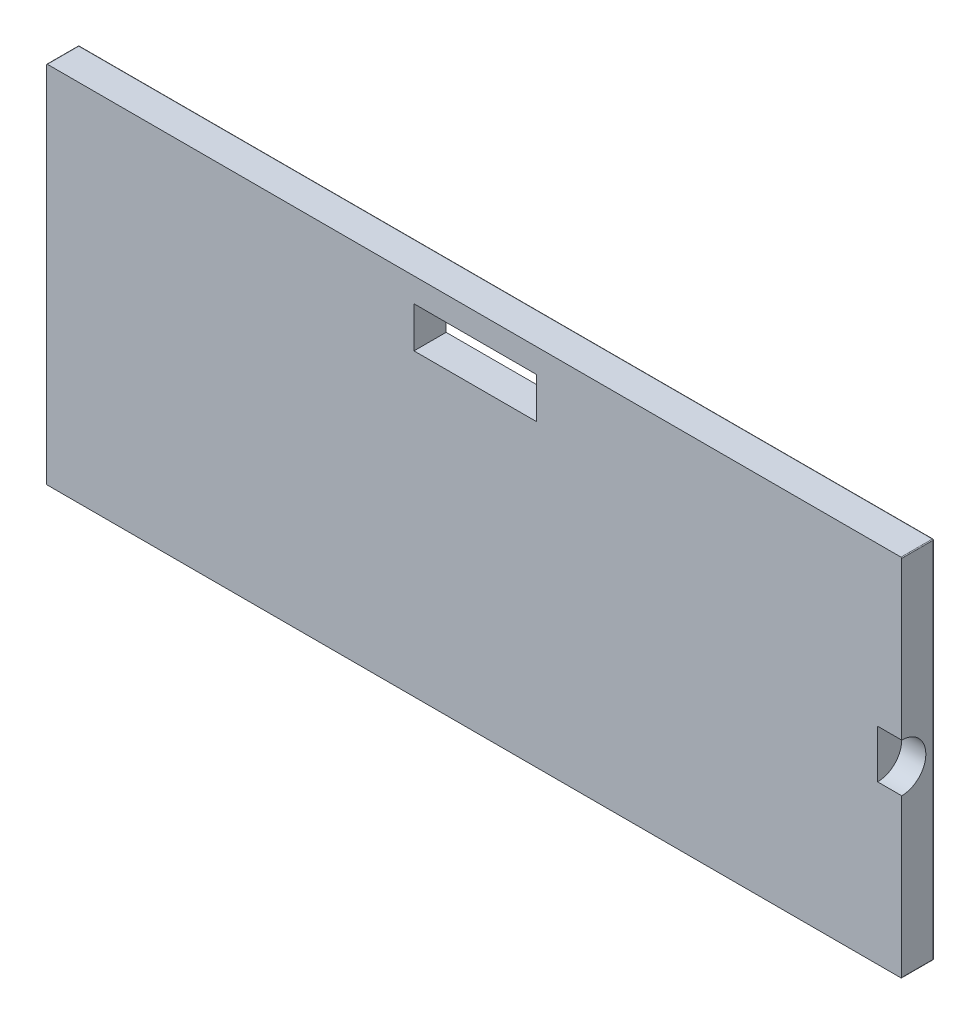
ISO-10303-21;
HEADER;
FILE_DESCRIPTION(('STEP AP214'),'2;1');
FILE_NAME('part.step','',(''),(''),'','','');
FILE_SCHEMA(('AUTOMOTIVE_DESIGN { 1 0 10303 214 1 1 1 1 }'));
ENDSEC;
DATA;
#1=APPLICATION_CONTEXT('core data for automotive mechanical design processes');
#2=APPLICATION_PROTOCOL_DEFINITION('international standard','automotive_design',2000,#1);
#3=PRODUCT_CONTEXT('',#1,'mechanical');
#4=PRODUCT('Part','Part','',(#3));
#5=PRODUCT_RELATED_PRODUCT_CATEGORY('part','',(#4));
#6=PRODUCT_DEFINITION_FORMATION('','',#4);
#7=PRODUCT_DEFINITION_CONTEXT('part definition',#1,'design');
#8=PRODUCT_DEFINITION('design','',#6,#7);
#9=PRODUCT_DEFINITION_SHAPE('','',#8);
#10=(LENGTH_UNIT() NAMED_UNIT(*) SI_UNIT(.MILLI.,.METRE.));
#11=(NAMED_UNIT(*) PLANE_ANGLE_UNIT() SI_UNIT($,.RADIAN.));
#12=(NAMED_UNIT(*) SI_UNIT($,.STERADIAN.) SOLID_ANGLE_UNIT());
#13=UNCERTAINTY_MEASURE_WITH_UNIT(LENGTH_MEASURE(1.E-05),#10,'distance_accuracy_value','');
#14=(GEOMETRIC_REPRESENTATION_CONTEXT(3) GLOBAL_UNCERTAINTY_ASSIGNED_CONTEXT((#13)) GLOBAL_UNIT_ASSIGNED_CONTEXT((#10,
#11,#12)) REPRESENTATION_CONTEXT('',''));
#15=CARTESIAN_POINT('',(0.,0.,0.));
#16=DIRECTION('',(0.,0.,1.));
#17=DIRECTION('',(1.,0.,0.));
#18=AXIS2_PLACEMENT_3D('',#15,#16,#17);
#19=CARTESIAN_POINT('',(0.,0.,-25.4));
#20=DIRECTION('',(-1.,0.,0.));
#21=DIRECTION('',(0.,0.,1.));
#22=AXIS2_PLACEMENT_3D('',#19,#20,#21);
#23=PLANE('',#22);
#24=DIRECTION('',(0.,-1.,0.));
#25=VECTOR('',#24,1.);
#26=CARTESIAN_POINT('',(0.,0.,76.2));
#27=LINE('',#26,#25);
#28=CARTESIAN_POINT('',(0.,1149.858,76.2));
#29=VERTEX_POINT('',#28);
#30=CARTESIAN_POINT('',(0.,2.54,76.2));
#31=VERTEX_POINT('',#30);
#32=EDGE_CURVE('E191',#29,#31,#27,.T.);
#33=ORIENTED_EDGE('',*,*,#32,.F.);
#34=DIRECTION('',(0.,0.,1.));
#35=VECTOR('',#34,1.);
#36=CARTESIAN_POINT('',(0.,1149.858,-25.4));
#37=LINE('',#36,#35);
#38=CARTESIAN_POINT('',(0.,1149.858,-22.86));
#39=VERTEX_POINT('',#38);
#40=EDGE_CURVE('E57',#29,#39,#37,.F.);
#41=ORIENTED_EDGE('',*,*,#40,.T.);
#42=DIRECTION('',(0.,-1.,0.));
#43=VECTOR('',#42,1.);
#44=CARTESIAN_POINT('',(0.,0.,-22.86));
#45=LINE('',#44,#43);
#46=CARTESIAN_POINT('',(0.,2.54,-22.86));
#47=VERTEX_POINT('',#46);
#48=EDGE_CURVE('E62',#39,#47,#45,.T.);
#49=ORIENTED_EDGE('',*,*,#48,.T.);
#50=DIRECTION('',(0.,0.,1.));
#51=VECTOR('',#50,1.);
#52=CARTESIAN_POINT('',(0.,2.54,-25.4));
#53=LINE('',#52,#51);
#54=EDGE_CURVE('E268',#47,#31,#53,.T.);
#55=ORIENTED_EDGE('',*,*,#54,.T.);
#56=EDGE_LOOP('',(#33,#41,#49,#55));
#57=FACE_BOUND('',#56,.T.);
#58=ADVANCED_FACE('F39',(#57),#23,.T.);
#59=CARTESIAN_POINT('',(0.,1152.398,-25.4));
#60=DIRECTION('',(0.,1.,0.));
#61=DIRECTION('',(0.,0.,1.));
#62=AXIS2_PLACEMENT_3D('',#59,#60,#61);
#63=PLANE('',#62);
#64=DIRECTION('',(-1.,0.,0.));
#65=VECTOR('',#64,1.);
#66=CARTESIAN_POINT('',(0.,1152.398,-22.86));
#67=LINE('',#66,#65);
#68=CARTESIAN_POINT('',(2701.544,1152.398,-22.86));
#69=VERTEX_POINT('',#68);
#70=CARTESIAN_POINT('',(2.54,1152.398,-22.86));
#71=VERTEX_POINT('',#70);
#72=EDGE_CURVE('E262',#69,#71,#67,.T.);
#73=ORIENTED_EDGE('',*,*,#72,.T.);
#74=DIRECTION('',(0.,0.,1.));
#75=VECTOR('',#74,1.);
#76=CARTESIAN_POINT('',(2.54,1152.398,-25.4));
#77=LINE('',#76,#75);
#78=CARTESIAN_POINT('',(2.54,1152.398,76.2));
#79=VERTEX_POINT('',#78);
#80=EDGE_CURVE('E265',#71,#79,#77,.T.);
#81=ORIENTED_EDGE('',*,*,#80,.T.);
#82=DIRECTION('',(-1.,0.,0.));
#83=VECTOR('',#82,1.);
#84=CARTESIAN_POINT('',(0.,1152.398,76.2));
#85=LINE('',#84,#83);
#86=CARTESIAN_POINT('',(2701.544,1152.398,76.2));
#87=VERTEX_POINT('',#86);
#88=EDGE_CURVE('E189',#87,#79,#85,.T.);
#89=ORIENTED_EDGE('',*,*,#88,.F.);
#90=DIRECTION('',(0.,0.,1.));
#91=VECTOR('',#90,1.);
#92=CARTESIAN_POINT('',(2701.544,1152.398,-25.4));
#93=LINE('',#92,#91);
#94=EDGE_CURVE('E259',#87,#69,#93,.F.);
#95=ORIENTED_EDGE('',*,*,#94,.T.);
#96=EDGE_LOOP('',(#73,#81,#89,#95));
#97=FACE_BOUND('',#96,.T.);
#98=ADVANCED_FACE('F400',(#97),#63,.T.);
#99=CARTESIAN_POINT('',(2704.084,0.,-25.4));
#100=DIRECTION('',(1.,0.,0.));
#101=DIRECTION('',(0.,0.,-1.));
#102=AXIS2_PLACEMENT_3D('',#99,#100,#101);
#103=PLANE('',#102);
#104=DIRECTION('',(0.,1.,0.));
#105=VECTOR('',#104,1.);
#106=CARTESIAN_POINT('',(2704.084,0.,76.2));
#107=LINE('',#106,#105);
#108=CARTESIAN_POINT('',(2704.084,2.54,76.2));
#109=VERTEX_POINT('',#108);
#110=CARTESIAN_POINT('',(2704.084,499.999,76.2));
#111=VERTEX_POINT('',#110);
#112=EDGE_CURVE('E184',#109,#111,#107,.T.);
#113=ORIENTED_EDGE('',*,*,#112,.F.);
#114=DIRECTION('',(0.,0.,1.));
#115=VECTOR('',#114,1.);
#116=CARTESIAN_POINT('',(2704.084,2.54,-25.4));
#117=LINE('',#116,#115);
#118=CARTESIAN_POINT('',(2704.084,2.54,-22.86));
#119=VERTEX_POINT('',#118);
#120=EDGE_CURVE('E256',#109,#119,#117,.F.);
#121=ORIENTED_EDGE('',*,*,#120,.T.);
#122=DIRECTION('',(0.,1.,0.));
#123=VECTOR('',#122,1.);
#124=CARTESIAN_POINT('',(2704.084,0.,-22.86));
#125=LINE('',#124,#123);
#126=CARTESIAN_POINT('',(2704.084,1149.858,-22.86));
#127=VERTEX_POINT('',#126);
#128=EDGE_CURVE('E253',#119,#127,#125,.T.);
#129=ORIENTED_EDGE('',*,*,#128,.T.);
#130=DIRECTION('',(0.,0.,1.));
#131=VECTOR('',#130,1.);
#132=CARTESIAN_POINT('',(2704.084,1149.858,-25.4));
#133=LINE('',#132,#131);
#134=CARTESIAN_POINT('',(2704.084,1149.858,76.2));
#135=VERTEX_POINT('',#134);
#136=EDGE_CURVE('E182',#127,#135,#133,.T.);
#137=ORIENTED_EDGE('',*,*,#136,.T.);
#138=CARTESIAN_POINT('',(2704.084,652.399,76.2));
#139=VERTEX_POINT('',#138);
#140=EDGE_CURVE('E174',#139,#135,#107,.T.);
#141=ORIENTED_EDGE('',*,*,#140,.F.);
#142=CARTESIAN_POINT('',(2704.084,576.199,76.2));
#143=DIRECTION('',(1.,0.,0.));
#144=DIRECTION('',(0.,0.,-1.));
#145=AXIS2_PLACEMENT_3D('',#142,#143,#144);
#146=CIRCLE('',#145,76.2);
#147=EDGE_CURVE('E155',#111,#139,#146,.T.);
#148=ORIENTED_EDGE('',*,*,#147,.F.);
#149=EDGE_LOOP('',(#113,#121,#129,#137,#141,#148));
#150=FACE_BOUND('',#149,.T.);
#151=ADVANCED_FACE('F180',(#150),#103,.T.);
#152=CARTESIAN_POINT('',(0.,0.,-25.4));
#153=DIRECTION('',(0.,-1.,0.));
#154=DIRECTION('',(0.,0.,-1.));
#155=AXIS2_PLACEMENT_3D('',#152,#153,#154);
#156=PLANE('',#155);
#157=DIRECTION('',(1.,0.,0.));
#158=VECTOR('',#157,1.);
#159=CARTESIAN_POINT('',(0.,0.,76.2));
#160=LINE('',#159,#158);
#161=CARTESIAN_POINT('',(2.54,0.,76.2));
#162=VERTEX_POINT('',#161);
#163=CARTESIAN_POINT('',(2701.544,0.,76.2));
#164=VERTEX_POINT('',#163);
#165=EDGE_CURVE('E185',#162,#164,#160,.T.);
#166=ORIENTED_EDGE('',*,*,#165,.F.);
#167=DIRECTION('',(0.,0.,1.));
#168=VECTOR('',#167,1.);
#169=CARTESIAN_POINT('',(2.54,0.,-25.4));
#170=LINE('',#169,#168);
#171=CARTESIAN_POINT('',(2.54,0.,-22.86));
#172=VERTEX_POINT('',#171);
#173=EDGE_CURVE('E235',#162,#172,#170,.F.);
#174=ORIENTED_EDGE('',*,*,#173,.T.);
#175=DIRECTION('',(1.,0.,0.));
#176=VECTOR('',#175,1.);
#177=CARTESIAN_POINT('',(0.,0.,-22.86));
#178=LINE('',#177,#176);
#179=CARTESIAN_POINT('',(2701.544,0.,-22.86));
#180=VERTEX_POINT('',#179);
#181=EDGE_CURVE('E231',#172,#180,#178,.T.);
#182=ORIENTED_EDGE('',*,*,#181,.T.);
#183=DIRECTION('',(0.,0.,1.));
#184=VECTOR('',#183,1.);
#185=CARTESIAN_POINT('',(2701.544,0.,-25.4));
#186=LINE('',#185,#184);
#187=EDGE_CURVE('E178',#180,#164,#186,.T.);
#188=ORIENTED_EDGE('',*,*,#187,.T.);
#189=EDGE_LOOP('',(#166,#174,#182,#188));
#190=FACE_BOUND('',#189,.T.);
#191=ADVANCED_FACE('F417',(#190),#156,.T.);
#192=CARTESIAN_POINT('',(0.,0.,-25.4));
#193=DIRECTION('',(0.,0.,-1.));
#194=DIRECTION('',(-1.,0.,0.));
#195=AXIS2_PLACEMENT_3D('',#192,#193,#194);
#196=PLANE('',#195);
#197=DIRECTION('',(0.,1.,0.));
#198=VECTOR('',#197,1.);
#199=CARTESIAN_POINT('',(2701.544,0.,-25.4));
#200=LINE('',#199,#198);
#201=CARTESIAN_POINT('',(2701.544,1149.858,-25.4));
#202=VERTEX_POINT('',#201);
#203=CARTESIAN_POINT('',(2701.544,2.54,-25.4));
#204=VERTEX_POINT('',#203);
#205=EDGE_CURVE('E244',#202,#204,#200,.F.);
#206=ORIENTED_EDGE('',*,*,#205,.T.);
#207=DIRECTION('',(1.,0.,0.));
#208=VECTOR('',#207,1.);
#209=CARTESIAN_POINT('',(0.,2.54,-25.4));
#210=LINE('',#209,#208);
#211=CARTESIAN_POINT('',(2.54,2.54,-25.4));
#212=VERTEX_POINT('',#211);
#213=EDGE_CURVE('E247',#204,#212,#210,.F.);
#214=ORIENTED_EDGE('',*,*,#213,.T.);
#215=DIRECTION('',(0.,-1.,0.));
#216=VECTOR('',#215,1.);
#217=CARTESIAN_POINT('',(2.54,0.,-25.4));
#218=LINE('',#217,#216);
#219=CARTESIAN_POINT('',(2.54,1149.858,-25.4));
#220=VERTEX_POINT('',#219);
#221=EDGE_CURVE('E238',#212,#220,#218,.F.);
#222=ORIENTED_EDGE('',*,*,#221,.T.);
#223=DIRECTION('',(-1.,0.,0.));
#224=VECTOR('',#223,1.);
#225=CARTESIAN_POINT('',(0.,1149.858,-25.4));
#226=LINE('',#225,#224);
#227=EDGE_CURVE('E241',#220,#202,#226,.F.);
#228=ORIENTED_EDGE('',*,*,#227,.T.);
#229=EDGE_LOOP('',(#206,#214,#222,#228));
#230=FACE_BOUND('',#229,.T.);
#231=DIRECTION('',(0.,-1.,0.));
#232=VECTOR('',#231,1.);
#233=CARTESIAN_POINT('',(1161.796,1076.198,-25.4));
#234=LINE('',#233,#232);
#235=CARTESIAN_POINT('',(1161.796,1076.198,-25.4));
#236=VERTEX_POINT('',#235);
#237=CARTESIAN_POINT('',(1161.796,947.166,-25.4));
#238=VERTEX_POINT('',#237);
#239=EDGE_CURVE('E197',#236,#238,#234,.T.);
#240=ORIENTED_EDGE('',*,*,#239,.T.);
#241=DIRECTION('',(1.,0.,0.));
#242=VECTOR('',#241,1.);
#243=CARTESIAN_POINT('',(1161.796,947.166,-25.4));
#244=LINE('',#243,#242);
#245=CARTESIAN_POINT('',(1548.892,947.166,-25.4));
#246=VERTEX_POINT('',#245);
#247=EDGE_CURVE('E201',#238,#246,#244,.T.);
#248=ORIENTED_EDGE('',*,*,#247,.T.);
#249=DIRECTION('',(0.,1.,0.));
#250=VECTOR('',#249,1.);
#251=CARTESIAN_POINT('',(1548.892,1076.198,-25.4));
#252=LINE('',#251,#250);
#253=CARTESIAN_POINT('',(1548.892,1076.198,-25.4));
#254=VERTEX_POINT('',#253);
#255=EDGE_CURVE('E205',#246,#254,#252,.T.);
#256=ORIENTED_EDGE('',*,*,#255,.T.);
#257=DIRECTION('',(-1.,0.,0.));
#258=VECTOR('',#257,1.);
#259=CARTESIAN_POINT('',(1161.796,1076.198,-25.4));
#260=LINE('',#259,#258);
#261=EDGE_CURVE('E209',#254,#236,#260,.T.);
#262=ORIENTED_EDGE('',*,*,#261,.T.);
#263=EDGE_LOOP('',(#240,#248,#256,#262));
#264=FACE_BOUND('',#263,.T.);
#265=ADVANCED_FACE('F387',(#230,#264),#196,.T.);
#266=CARTESIAN_POINT('',(1161.796,1076.198,-25.4));
#267=DIRECTION('',(-1.,0.,0.));
#268=DIRECTION('',(0.,0.,1.));
#269=AXIS2_PLACEMENT_3D('',#266,#267,#268);
#270=PLANE('',#269);
#271=DIRECTION('',(0.,0.,1.));
#272=VECTOR('',#271,1.);
#273=CARTESIAN_POINT('',(1161.796,1076.198,-25.4));
#274=LINE('',#273,#272);
#275=CARTESIAN_POINT('',(1161.796,1076.198,76.2));
#276=VERTEX_POINT('',#275);
#277=EDGE_CURVE('E214',#236,#276,#274,.T.);
#278=ORIENTED_EDGE('',*,*,#277,.T.);
#279=DIRECTION('',(0.,-1.,0.));
#280=VECTOR('',#279,1.);
#281=CARTESIAN_POINT('',(1161.796,1076.198,76.2));
#282=LINE('',#281,#280);
#283=CARTESIAN_POINT('',(1161.796,947.166,76.2));
#284=VERTEX_POINT('',#283);
#285=EDGE_CURVE('E362',#276,#284,#282,.T.);
#286=ORIENTED_EDGE('',*,*,#285,.T.);
#287=DIRECTION('',(0.,0.,1.));
#288=VECTOR('',#287,1.);
#289=CARTESIAN_POINT('',(1161.796,947.166,-25.4));
#290=LINE('',#289,#288);
#291=EDGE_CURVE('E213',#238,#284,#290,.T.);
#292=ORIENTED_EDGE('',*,*,#291,.F.);
#293=ORIENTED_EDGE('',*,*,#239,.F.);
#294=EDGE_LOOP('',(#278,#286,#292,#293));
#295=FACE_BOUND('',#294,.T.);
#296=ADVANCED_FACE('F553',(#295),#270,.F.);
#297=CARTESIAN_POINT('',(1161.796,1076.198,-25.4));
#298=DIRECTION('',(0.,1.,0.));
#299=DIRECTION('',(0.,0.,1.));
#300=AXIS2_PLACEMENT_3D('',#297,#298,#299);
#301=PLANE('',#300);
#302=DIRECTION('',(0.,0.,1.));
#303=VECTOR('',#302,1.);
#304=CARTESIAN_POINT('',(1548.892,1076.198,-25.4));
#305=LINE('',#304,#303);
#306=CARTESIAN_POINT('',(1548.892,1076.198,76.2));
#307=VERTEX_POINT('',#306);
#308=EDGE_CURVE('E217',#254,#307,#305,.T.);
#309=ORIENTED_EDGE('',*,*,#308,.T.);
#310=DIRECTION('',(-1.,0.,0.));
#311=VECTOR('',#310,1.);
#312=CARTESIAN_POINT('',(1161.796,1076.198,76.2));
#313=LINE('',#312,#311);
#314=EDGE_CURVE('E349',#307,#276,#313,.T.);
#315=ORIENTED_EDGE('',*,*,#314,.T.);
#316=ORIENTED_EDGE('',*,*,#277,.F.);
#317=ORIENTED_EDGE('',*,*,#261,.F.);
#318=EDGE_LOOP('',(#309,#315,#316,#317));
#319=FACE_BOUND('',#318,.T.);
#320=ADVANCED_FACE('F544',(#319),#301,.F.);
#321=CARTESIAN_POINT('',(1548.892,1076.198,-25.4));
#322=DIRECTION('',(1.,0.,0.));
#323=DIRECTION('',(0.,0.,-1.));
#324=AXIS2_PLACEMENT_3D('',#321,#322,#323);
#325=PLANE('',#324);
#326=DIRECTION('',(0.,0.,1.));
#327=VECTOR('',#326,1.);
#328=CARTESIAN_POINT('',(1548.892,947.166,-25.4));
#329=LINE('',#328,#327);
#330=CARTESIAN_POINT('',(1548.892,947.166,76.2));
#331=VERTEX_POINT('',#330);
#332=EDGE_CURVE('E220',#246,#331,#329,.T.);
#333=ORIENTED_EDGE('',*,*,#332,.T.);
#334=DIRECTION('',(0.,1.,0.));
#335=VECTOR('',#334,1.);
#336=CARTESIAN_POINT('',(1548.892,1076.198,76.2));
#337=LINE('',#336,#335);
#338=EDGE_CURVE('E352',#331,#307,#337,.T.);
#339=ORIENTED_EDGE('',*,*,#338,.T.);
#340=ORIENTED_EDGE('',*,*,#308,.F.);
#341=ORIENTED_EDGE('',*,*,#255,.F.);
#342=EDGE_LOOP('',(#333,#339,#340,#341));
#343=FACE_BOUND('',#342,.T.);
#344=ADVANCED_FACE('F535',(#343),#325,.F.);
#345=CARTESIAN_POINT('',(1161.796,947.166,-25.4));
#346=DIRECTION('',(0.,-1.,0.));
#347=DIRECTION('',(1.,0.,0.));
#348=AXIS2_PLACEMENT_3D('',#345,#346,#347);
#349=PLANE('',#348);
#350=ORIENTED_EDGE('',*,*,#291,.T.);
#351=DIRECTION('',(1.,0.,0.));
#352=VECTOR('',#351,1.);
#353=CARTESIAN_POINT('',(1161.796,947.166,76.2));
#354=LINE('',#353,#352);
#355=EDGE_CURVE('E358',#284,#331,#354,.T.);
#356=ORIENTED_EDGE('',*,*,#355,.T.);
#357=ORIENTED_EDGE('',*,*,#332,.F.);
#358=ORIENTED_EDGE('',*,*,#247,.F.);
#359=EDGE_LOOP('',(#350,#356,#357,#358));
#360=FACE_BOUND('',#359,.T.);
#361=ADVANCED_FACE('F527',(#360),#349,.F.);
#362=CARTESIAN_POINT('',(0.,0.,76.2));
#363=DIRECTION('',(0.,0.,-1.));
#364=DIRECTION('',(-1.,0.,0.));
#365=AXIS2_PLACEMENT_3D('',#362,#363,#364);
#366=PLANE('',#365);
#367=ORIENTED_EDGE('',*,*,#88,.T.);
#368=CARTESIAN_POINT('',(2.54,1149.858,76.2));
#369=DIRECTION('',(0.,0.,-1.));
#370=DIRECTION('',(-1.,0.,0.));
#371=AXIS2_PLACEMENT_3D('',#368,#369,#370);
#372=CIRCLE('',#371,2.54);
#373=EDGE_CURVE('E11',#79,#29,#372,.F.);
#374=ORIENTED_EDGE('',*,*,#373,.T.);
#375=ORIENTED_EDGE('',*,*,#32,.T.);
#376=CARTESIAN_POINT('',(2.54,2.54,76.2));
#377=DIRECTION('',(0.,0.,-1.));
#378=DIRECTION('',(-1.,0.,0.));
#379=AXIS2_PLACEMENT_3D('',#376,#377,#378);
#380=CIRCLE('',#379,2.54);
#381=EDGE_CURVE('E49',#31,#162,#380,.F.);
#382=ORIENTED_EDGE('',*,*,#381,.T.);
#383=ORIENTED_EDGE('',*,*,#165,.T.);
#384=CARTESIAN_POINT('',(2701.544,2.54,76.2));
#385=DIRECTION('',(0.,0.,-1.));
#386=DIRECTION('',(-1.,0.,0.));
#387=AXIS2_PLACEMENT_3D('',#384,#385,#386);
#388=CIRCLE('',#387,2.54);
#389=EDGE_CURVE('E278',#164,#109,#388,.F.);
#390=ORIENTED_EDGE('',*,*,#389,.T.);
#391=ORIENTED_EDGE('',*,*,#112,.T.);
#392=DIRECTION('',(1.,0.,0.));
#393=VECTOR('',#392,1.);
#394=CARTESIAN_POINT('',(2627.884,499.999,76.2));
#395=LINE('',#394,#393);
#396=CARTESIAN_POINT('',(2627.884,499.999,76.2));
#397=VERTEX_POINT('',#396);
#398=EDGE_CURVE('E162',#111,#397,#395,.F.);
#399=ORIENTED_EDGE('',*,*,#398,.T.);
#400=DIRECTION('',(0.,-1.,0.));
#401=VECTOR('',#400,1.);
#402=CARTESIAN_POINT('',(2627.884,0.,76.2));
#403=LINE('',#402,#401);
#404=CARTESIAN_POINT('',(2627.884,652.399,76.2));
#405=VERTEX_POINT('',#404);
#406=EDGE_CURVE('E176',#405,#397,#403,.T.);
#407=ORIENTED_EDGE('',*,*,#406,.F.);
#408=DIRECTION('',(1.,0.,0.));
#409=VECTOR('',#408,1.);
#410=CARTESIAN_POINT('',(2627.884,652.399,76.2));
#411=LINE('',#410,#409);
#412=EDGE_CURVE('E159',#405,#139,#411,.T.);
#413=ORIENTED_EDGE('',*,*,#412,.T.);
#414=ORIENTED_EDGE('',*,*,#140,.T.);
#415=CARTESIAN_POINT('',(2701.544,1149.858,76.2));
#416=DIRECTION('',(0.,0.,-1.));
#417=DIRECTION('',(-1.,0.,0.));
#418=AXIS2_PLACEMENT_3D('',#415,#416,#417);
#419=CIRCLE('',#418,2.54);
#420=EDGE_CURVE('E275',#135,#87,#419,.F.);
#421=ORIENTED_EDGE('',*,*,#420,.T.);
#422=EDGE_LOOP('',(#367,#374,#375,#382,#383,#390,#391,#399,#407,#413,#414,#421));
#423=FACE_BOUND('',#422,.T.);
#424=ORIENTED_EDGE('',*,*,#285,.F.);
#425=ORIENTED_EDGE('',*,*,#314,.F.);
#426=ORIENTED_EDGE('',*,*,#338,.F.);
#427=ORIENTED_EDGE('',*,*,#355,.F.);
#428=EDGE_LOOP('',(#424,#425,#426,#427));
#429=FACE_BOUND('',#428,.T.);
#430=ADVANCED_FACE('F172',(#423,#429),#366,.F.);
#431=CARTESIAN_POINT('',(2627.884,576.199,76.2));
#432=DIRECTION('',(1.,0.,0.));
#433=DIRECTION('',(0.,0.,-1.));
#434=AXIS2_PLACEMENT_3D('',#431,#432,#433);
#435=CYLINDRICAL_SURFACE('',#434,76.2);
#436=CARTESIAN_POINT('',(2627.884,576.199,76.2));
#437=DIRECTION('',(1.,0.,0.));
#438=DIRECTION('',(0.,0.,-1.));
#439=AXIS2_PLACEMENT_3D('',#436,#437,#438);
#440=CIRCLE('',#439,76.2);
#441=EDGE_CURVE('E167',#397,#405,#440,.T.);
#442=ORIENTED_EDGE('',*,*,#441,.F.);
#443=ORIENTED_EDGE('',*,*,#398,.F.);
#444=ORIENTED_EDGE('',*,*,#147,.T.);
#445=ORIENTED_EDGE('',*,*,#412,.F.);
#446=EDGE_LOOP('',(#442,#443,#444,#445));
#447=FACE_BOUND('',#446,.T.);
#448=ADVANCED_FACE('F158',(#447),#435,.F.);
#449=CARTESIAN_POINT('',(2627.884,576.199,76.2));
#450=DIRECTION('',(1.,0.,0.));
#451=DIRECTION('',(0.,0.,-1.));
#452=AXIS2_PLACEMENT_3D('',#449,#450,#451);
#453=PLANE('',#452);
#454=ORIENTED_EDGE('',*,*,#406,.T.);
#455=ORIENTED_EDGE('',*,*,#441,.T.);
#456=EDGE_LOOP('',(#454,#455));
#457=FACE_BOUND('',#456,.T.);
#458=ADVANCED_FACE('F368',(#457),#453,.T.);
#459=CARTESIAN_POINT('',(2.54,1149.858,-25.4));
#460=DIRECTION('',(0.,0.,1.));
#461=DIRECTION('',(1.,0.,0.));
#462=AXIS2_PLACEMENT_3D('',#459,#460,#461);
#463=CYLINDRICAL_SURFACE('',#462,2.54);
#464=ORIENTED_EDGE('',*,*,#373,.F.);
#465=ORIENTED_EDGE('',*,*,#80,.F.);
#466=CARTESIAN_POINT('',(2.54,1149.858,-22.86));
#467=DIRECTION('',(0.,0.,-1.));
#468=DIRECTION('',(-1.,0.,0.));
#469=AXIS2_PLACEMENT_3D('',#466,#467,#468);
#470=CIRCLE('',#469,2.54);
#471=EDGE_CURVE('E320',#39,#71,#470,.T.);
#472=ORIENTED_EDGE('',*,*,#471,.F.);
#473=ORIENTED_EDGE('',*,*,#40,.F.);
#474=EDGE_LOOP('',(#464,#465,#472,#473));
#475=FACE_BOUND('',#474,.T.);
#476=ADVANCED_FACE('F41',(#475),#463,.T.);
#477=CARTESIAN_POINT('',(2701.544,1149.858,-25.4));
#478=DIRECTION('',(0.,0.,1.));
#479=DIRECTION('',(1.,0.,0.));
#480=AXIS2_PLACEMENT_3D('',#477,#478,#479);
#481=CYLINDRICAL_SURFACE('',#480,2.54);
#482=ORIENTED_EDGE('',*,*,#420,.F.);
#483=ORIENTED_EDGE('',*,*,#136,.F.);
#484=CARTESIAN_POINT('',(2701.544,1149.858,-22.86));
#485=DIRECTION('',(0.,0.,-1.));
#486=DIRECTION('',(-1.,0.,0.));
#487=AXIS2_PLACEMENT_3D('',#484,#485,#486);
#488=CIRCLE('',#487,2.54);
#489=EDGE_CURVE('E317',#69,#127,#488,.T.);
#490=ORIENTED_EDGE('',*,*,#489,.F.);
#491=ORIENTED_EDGE('',*,*,#94,.F.);
#492=EDGE_LOOP('',(#482,#483,#490,#491));
#493=FACE_BOUND('',#492,.T.);
#494=ADVANCED_FACE('F397',(#493),#481,.T.);
#495=CARTESIAN_POINT('',(0.,1149.858,-22.86));
#496=DIRECTION('',(-1.,0.,0.));
#497=DIRECTION('',(0.,0.,1.));
#498=AXIS2_PLACEMENT_3D('',#495,#496,#497);
#499=CYLINDRICAL_SURFACE('',#498,2.54);
#500=CARTESIAN_POINT('',(2.54,1149.858,-22.86));
#501=DIRECTION('',(-1.,0.,0.));
#502=DIRECTION('',(0.,0.,1.));
#503=AXIS2_PLACEMENT_3D('',#500,#501,#502);
#504=CIRCLE('',#503,2.54);
#505=EDGE_CURVE('E43',#71,#220,#504,.T.);
#506=ORIENTED_EDGE('',*,*,#505,.F.);
#507=ORIENTED_EDGE('',*,*,#72,.F.);
#508=CARTESIAN_POINT('',(2701.544,1149.858,-22.86));
#509=DIRECTION('',(1.,0.,0.));
#510=DIRECTION('',(0.,0.,-1.));
#511=AXIS2_PLACEMENT_3D('',#508,#509,#510);
#512=CIRCLE('',#511,2.54);
#513=EDGE_CURVE('E313',#202,#69,#512,.T.);
#514=ORIENTED_EDGE('',*,*,#513,.F.);
#515=ORIENTED_EDGE('',*,*,#227,.F.);
#516=EDGE_LOOP('',(#506,#507,#514,#515));
#517=FACE_BOUND('',#516,.T.);
#518=ADVANCED_FACE('F391',(#517),#499,.T.);
#519=CARTESIAN_POINT('',(2.54,1149.858,-22.86));
#520=DIRECTION('',(0.,1.,0.));
#521=DIRECTION('',(0.,0.,1.));
#522=AXIS2_PLACEMENT_3D('',#519,#520,#521);
#523=SPHERICAL_SURFACE('',#522,2.54);
#524=ORIENTED_EDGE('',*,*,#471,.T.);
#525=ORIENTED_EDGE('',*,*,#505,.T.);
#526=CARTESIAN_POINT('',(2.54,1149.858,-22.86));
#527=DIRECTION('',(0.,1.,0.));
#528=DIRECTION('',(0.,0.,1.));
#529=AXIS2_PLACEMENT_3D('',#526,#527,#528);
#530=CIRCLE('',#529,2.54);
#531=EDGE_CURVE('E309',#39,#220,#530,.F.);
#532=ORIENTED_EDGE('',*,*,#531,.F.);
#533=EDGE_LOOP('',(#524,#525,#532));
#534=FACE_BOUND('',#533,.T.);
#535=ADVANCED_FACE('F328',(#534),#523,.T.);
#536=CARTESIAN_POINT('',(2701.544,1149.858,-22.86));
#537=DIRECTION('',(0.,1.,0.));
#538=DIRECTION('',(0.,0.,1.));
#539=AXIS2_PLACEMENT_3D('',#536,#537,#538);
#540=SPHERICAL_SURFACE('',#539,2.54);
#541=ORIENTED_EDGE('',*,*,#513,.T.);
#542=ORIENTED_EDGE('',*,*,#489,.T.);
#543=CARTESIAN_POINT('',(2701.544,1149.858,-22.86));
#544=DIRECTION('',(0.,1.,0.));
#545=DIRECTION('',(0.,0.,1.));
#546=AXIS2_PLACEMENT_3D('',#543,#544,#545);
#547=CIRCLE('',#546,2.54);
#548=EDGE_CURVE('E305',#202,#127,#547,.F.);
#549=ORIENTED_EDGE('',*,*,#548,.F.);
#550=EDGE_LOOP('',(#541,#542,#549));
#551=FACE_BOUND('',#550,.T.);
#552=ADVANCED_FACE('F394',(#551),#540,.T.);
#553=CARTESIAN_POINT('',(2.54,0.,-22.86));
#554=DIRECTION('',(0.,-1.,0.));
#555=DIRECTION('',(0.,0.,-1.));
#556=AXIS2_PLACEMENT_3D('',#553,#554,#555);
#557=CYLINDRICAL_SURFACE('',#556,2.54);
#558=ORIENTED_EDGE('',*,*,#531,.T.);
#559=ORIENTED_EDGE('',*,*,#221,.F.);
#560=CARTESIAN_POINT('',(2.54,2.54,-22.86));
#561=DIRECTION('',(0.,-1.,0.));
#562=DIRECTION('',(0.,0.,-1.));
#563=AXIS2_PLACEMENT_3D('',#560,#561,#562);
#564=CIRCLE('',#563,2.54);
#565=EDGE_CURVE('E301',#47,#212,#564,.T.);
#566=ORIENTED_EDGE('',*,*,#565,.F.);
#567=ORIENTED_EDGE('',*,*,#48,.F.);
#568=EDGE_LOOP('',(#558,#559,#566,#567));
#569=FACE_BOUND('',#568,.T.);
#570=ADVANCED_FACE('F334',(#569),#557,.T.);
#571=CARTESIAN_POINT('',(2.54,2.54,-25.4));
#572=DIRECTION('',(0.,0.,1.));
#573=DIRECTION('',(1.,0.,0.));
#574=AXIS2_PLACEMENT_3D('',#571,#572,#573);
#575=CYLINDRICAL_SURFACE('',#574,2.54);
#576=ORIENTED_EDGE('',*,*,#381,.F.);
#577=ORIENTED_EDGE('',*,*,#54,.F.);
#578=CARTESIAN_POINT('',(2.54,2.54,-22.86));
#579=DIRECTION('',(0.,0.,-1.));
#580=DIRECTION('',(-1.,0.,0.));
#581=AXIS2_PLACEMENT_3D('',#578,#579,#580);
#582=CIRCLE('',#581,2.54);
#583=EDGE_CURVE('E297',#172,#47,#582,.T.);
#584=ORIENTED_EDGE('',*,*,#583,.F.);
#585=ORIENTED_EDGE('',*,*,#173,.F.);
#586=EDGE_LOOP('',(#576,#577,#584,#585));
#587=FACE_BOUND('',#586,.T.);
#588=ADVANCED_FACE('F344',(#587),#575,.T.);
#589=CARTESIAN_POINT('',(2701.544,2.54,-25.4));
#590=DIRECTION('',(0.,0.,1.));
#591=DIRECTION('',(1.,0.,0.));
#592=AXIS2_PLACEMENT_3D('',#589,#590,#591);
#593=CYLINDRICAL_SURFACE('',#592,2.54);
#594=ORIENTED_EDGE('',*,*,#389,.F.);
#595=ORIENTED_EDGE('',*,*,#187,.F.);
#596=CARTESIAN_POINT('',(2701.544,2.54,-22.86));
#597=DIRECTION('',(0.,0.,-1.));
#598=DIRECTION('',(-1.,0.,0.));
#599=AXIS2_PLACEMENT_3D('',#596,#597,#598);
#600=CIRCLE('',#599,2.54);
#601=EDGE_CURVE('E293',#119,#180,#600,.T.);
#602=ORIENTED_EDGE('',*,*,#601,.F.);
#603=ORIENTED_EDGE('',*,*,#120,.F.);
#604=EDGE_LOOP('',(#594,#595,#602,#603));
#605=FACE_BOUND('',#604,.T.);
#606=ADVANCED_FACE('F374',(#605),#593,.T.);
#607=CARTESIAN_POINT('',(2701.544,0.,-22.86));
#608=DIRECTION('',(0.,1.,0.));
#609=DIRECTION('',(0.,0.,1.));
#610=AXIS2_PLACEMENT_3D('',#607,#608,#609);
#611=CYLINDRICAL_SURFACE('',#610,2.54);
#612=ORIENTED_EDGE('',*,*,#548,.T.);
#613=ORIENTED_EDGE('',*,*,#128,.F.);
#614=CARTESIAN_POINT('',(2701.544,2.54,-22.86));
#615=DIRECTION('',(0.,-1.,0.));
#616=DIRECTION('',(0.,0.,-1.));
#617=AXIS2_PLACEMENT_3D('',#614,#615,#616);
#618=CIRCLE('',#617,2.54);
#619=EDGE_CURVE('E289',#204,#119,#618,.T.);
#620=ORIENTED_EDGE('',*,*,#619,.F.);
#621=ORIENTED_EDGE('',*,*,#205,.F.);
#622=EDGE_LOOP('',(#612,#613,#620,#621));
#623=FACE_BOUND('',#622,.T.);
#624=ADVANCED_FACE('F383',(#623),#611,.T.);
#625=CARTESIAN_POINT('',(2.54,2.54,-22.86));
#626=DIRECTION('',(-1.,0.,0.));
#627=DIRECTION('',(0.,0.,1.));
#628=AXIS2_PLACEMENT_3D('',#625,#626,#627);
#629=SPHERICAL_SURFACE('',#628,2.54);
#630=ORIENTED_EDGE('',*,*,#583,.T.);
#631=ORIENTED_EDGE('',*,*,#565,.T.);
#632=CARTESIAN_POINT('',(2.54,2.54,-22.86));
#633=DIRECTION('',(-1.,0.,0.));
#634=DIRECTION('',(0.,0.,1.));
#635=AXIS2_PLACEMENT_3D('',#632,#633,#634);
#636=CIRCLE('',#635,2.54);
#637=EDGE_CURVE('E286',#172,#212,#636,.F.);
#638=ORIENTED_EDGE('',*,*,#637,.F.);
#639=EDGE_LOOP('',(#630,#631,#638));
#640=FACE_BOUND('',#639,.T.);
#641=ADVANCED_FACE('F339',(#640),#629,.T.);
#642=CARTESIAN_POINT('',(2701.544,2.54,-22.86));
#643=DIRECTION('',(1.,0.,0.));
#644=DIRECTION('',(0.,0.,-1.));
#645=AXIS2_PLACEMENT_3D('',#642,#643,#644);
#646=SPHERICAL_SURFACE('',#645,2.54);
#647=ORIENTED_EDGE('',*,*,#619,.T.);
#648=ORIENTED_EDGE('',*,*,#601,.T.);
#649=CARTESIAN_POINT('',(2701.544,2.54,-22.86));
#650=DIRECTION('',(1.,0.,0.));
#651=DIRECTION('',(0.,0.,-1.));
#652=AXIS2_PLACEMENT_3D('',#649,#650,#651);
#653=CIRCLE('',#652,2.54);
#654=EDGE_CURVE('E283',#204,#180,#653,.F.);
#655=ORIENTED_EDGE('',*,*,#654,.F.);
#656=EDGE_LOOP('',(#647,#648,#655));
#657=FACE_BOUND('',#656,.T.);
#658=ADVANCED_FACE('F379',(#657),#646,.T.);
#659=CARTESIAN_POINT('',(0.,2.54,-22.86));
#660=DIRECTION('',(1.,0.,0.));
#661=DIRECTION('',(0.,0.,-1.));
#662=AXIS2_PLACEMENT_3D('',#659,#660,#661);
#663=CYLINDRICAL_SURFACE('',#662,2.54);
#664=ORIENTED_EDGE('',*,*,#637,.T.);
#665=ORIENTED_EDGE('',*,*,#213,.F.);
#666=ORIENTED_EDGE('',*,*,#654,.T.);
#667=ORIENTED_EDGE('',*,*,#181,.F.);
#668=EDGE_LOOP('',(#664,#665,#666,#667));
#669=FACE_BOUND('',#668,.T.);
#670=ADVANCED_FACE('F385',(#669),#663,.T.);
#671=CLOSED_SHELL('',(#58,#98,#151,#191,#265,#296,#320,#344,#361,#430,#448,#458,#476,#494,#518,
#535,#552,#570,#588,#606,#624,#641,#658,#670));
#672=MANIFOLD_SOLID_BREP('B2',#671);
#673=ADVANCED_BREP_SHAPE_REPRESENTATION('',(#18,#672),#14);
#674=SHAPE_DEFINITION_REPRESENTATION(#9,#673);
ENDSEC;
END-ISO-10303-21;
